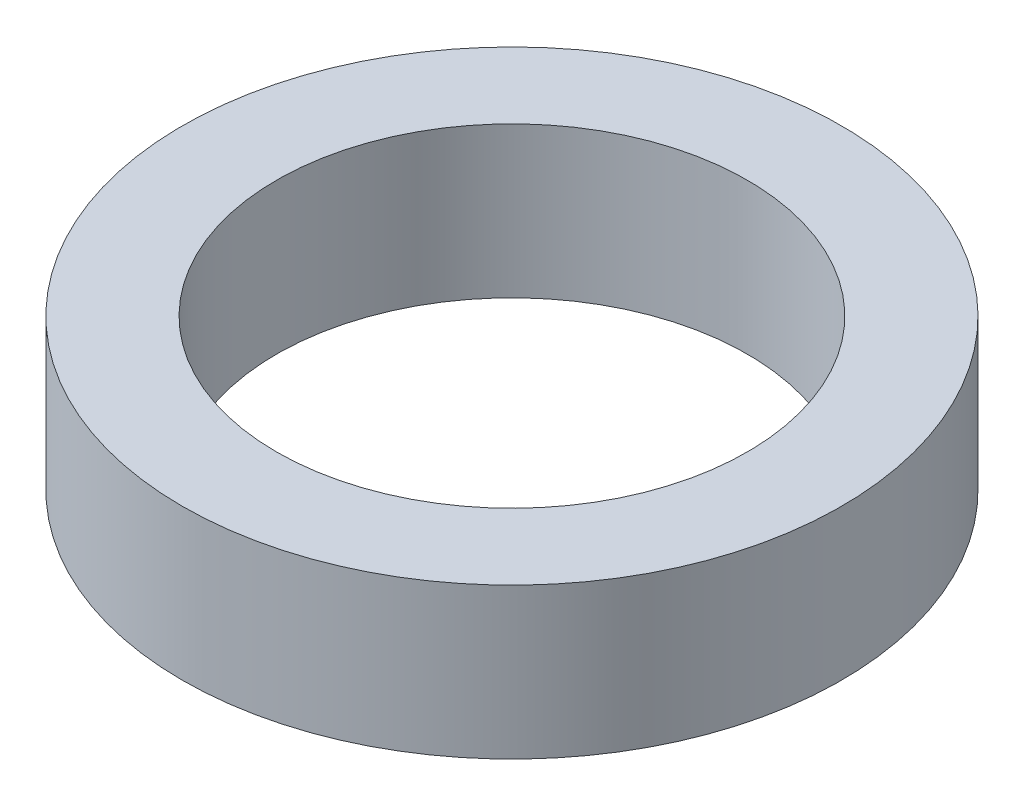
ISO-10303-21;
HEADER;
FILE_DESCRIPTION(('STEP AP214'),'2;1');
FILE_NAME('part.step','',(''),(''),'','','');
FILE_SCHEMA(('AUTOMOTIVE_DESIGN { 1 0 10303 214 1 1 1 1 }'));
ENDSEC;
DATA;
#1=APPLICATION_CONTEXT('core data for automotive mechanical design processes');
#2=APPLICATION_PROTOCOL_DEFINITION('international standard','automotive_design',2000,#1);
#3=PRODUCT_CONTEXT('',#1,'mechanical');
#4=PRODUCT('Part','Part','',(#3));
#5=PRODUCT_RELATED_PRODUCT_CATEGORY('part','',(#4));
#6=PRODUCT_DEFINITION_FORMATION('','',#4);
#7=PRODUCT_DEFINITION_CONTEXT('part definition',#1,'design');
#8=PRODUCT_DEFINITION('design','',#6,#7);
#9=PRODUCT_DEFINITION_SHAPE('','',#8);
#10=(LENGTH_UNIT() NAMED_UNIT(*) SI_UNIT(.MILLI.,.METRE.));
#11=(NAMED_UNIT(*) PLANE_ANGLE_UNIT() SI_UNIT($,.RADIAN.));
#12=(NAMED_UNIT(*) SI_UNIT($,.STERADIAN.) SOLID_ANGLE_UNIT());
#13=UNCERTAINTY_MEASURE_WITH_UNIT(LENGTH_MEASURE(1.E-05),#10,'distance_accuracy_value','');
#14=(GEOMETRIC_REPRESENTATION_CONTEXT(3) GLOBAL_UNCERTAINTY_ASSIGNED_CONTEXT((#13)) GLOBAL_UNIT_ASSIGNED_CONTEXT((#10,
#11,#12)) REPRESENTATION_CONTEXT('',''));
#15=CARTESIAN_POINT('',(0.,0.,0.));
#16=DIRECTION('',(0.,0.,1.));
#17=DIRECTION('',(1.,0.,0.));
#18=AXIS2_PLACEMENT_3D('',#15,#16,#17);
#19=CARTESIAN_POINT('',(0.,2.54,0.));
#20=DIRECTION('',(0.,-1.,0.));
#21=DIRECTION('',(0.,0.,-1.));
#22=AXIS2_PLACEMENT_3D('',#19,#20,#21);
#23=CYLINDRICAL_SURFACE('',#22,3.96875);
#24=CARTESIAN_POINT('',(0.,2.54,0.));
#25=DIRECTION('',(0.,1.,0.));
#26=DIRECTION('',(0.,0.,1.));
#27=AXIS2_PLACEMENT_3D('',#24,#25,#26);
#28=CIRCLE('',#27,3.96875);
#29=CARTESIAN_POINT('',(0.,2.54,3.96875));
#30=VERTEX_POINT('',#29);
#31=EDGE_CURVE('E63',#30,#30,#28,.T.);
#32=ORIENTED_EDGE('',*,*,#31,.T.);
#33=EDGE_LOOP('',(#32));
#34=FACE_BOUND('',#33,.T.);
#35=CARTESIAN_POINT('',(0.,0.,0.));
#36=DIRECTION('',(0.,1.,0.));
#37=DIRECTION('',(0.,0.,1.));
#38=AXIS2_PLACEMENT_3D('',#35,#36,#37);
#39=CIRCLE('',#38,3.96875);
#40=CARTESIAN_POINT('',(0.,0.,3.96875));
#41=VERTEX_POINT('',#40);
#42=EDGE_CURVE('E70',#41,#41,#39,.T.);
#43=ORIENTED_EDGE('',*,*,#42,.F.);
#44=EDGE_LOOP('',(#43));
#45=FACE_BOUND('',#44,.T.);
#46=ADVANCED_FACE('F55',(#34,#45),#23,.F.);
#47=CARTESIAN_POINT('',(0.,0.,0.));
#48=DIRECTION('',(0.,1.,0.));
#49=DIRECTION('',(0.,0.,1.));
#50=AXIS2_PLACEMENT_3D('',#47,#48,#49);
#51=PLANE('',#50);
#52=ORIENTED_EDGE('',*,*,#42,.T.);
#53=EDGE_LOOP('',(#52));
#54=FACE_BOUND('',#53,.T.);
#55=CARTESIAN_POINT('',(0.,0.,0.));
#56=DIRECTION('',(0.,1.,0.));
#57=DIRECTION('',(0.,0.,1.));
#58=AXIS2_PLACEMENT_3D('',#55,#56,#57);
#59=CIRCLE('',#58,5.55625);
#60=CARTESIAN_POINT('',(0.,0.,5.55625));
#61=VERTEX_POINT('',#60);
#62=EDGE_CURVE('E58',#61,#61,#59,.T.);
#63=ORIENTED_EDGE('',*,*,#62,.F.);
#64=EDGE_LOOP('',(#63));
#65=FACE_BOUND('',#64,.T.);
#66=ADVANCED_FACE('F81',(#54,#65),#51,.F.);
#67=CARTESIAN_POINT('',(0.,2.54,0.));
#68=DIRECTION('',(0.,-1.,0.));
#69=DIRECTION('',(0.,0.,-1.));
#70=AXIS2_PLACEMENT_3D('',#67,#68,#69);
#71=CYLINDRICAL_SURFACE('',#70,5.55625);
#72=CARTESIAN_POINT('',(0.,2.54,0.));
#73=DIRECTION('',(0.,1.,0.));
#74=DIRECTION('',(0.,0.,1.));
#75=AXIS2_PLACEMENT_3D('',#72,#73,#74);
#76=CIRCLE('',#75,5.55625);
#77=CARTESIAN_POINT('',(0.,2.54,5.55625));
#78=VERTEX_POINT('',#77);
#79=EDGE_CURVE('E11',#78,#78,#76,.T.);
#80=ORIENTED_EDGE('',*,*,#79,.F.);
#81=EDGE_LOOP('',(#80));
#82=FACE_BOUND('',#81,.T.);
#83=ORIENTED_EDGE('',*,*,#62,.T.);
#84=EDGE_LOOP('',(#83));
#85=FACE_BOUND('',#84,.T.);
#86=ADVANCED_FACE('F79',(#82,#85),#71,.T.);
#87=CARTESIAN_POINT('',(0.,2.54,0.));
#88=DIRECTION('',(0.,1.,0.));
#89=DIRECTION('',(0.,0.,1.));
#90=AXIS2_PLACEMENT_3D('',#87,#88,#89);
#91=PLANE('',#90);
#92=ORIENTED_EDGE('',*,*,#31,.F.);
#93=EDGE_LOOP('',(#92));
#94=FACE_BOUND('',#93,.T.);
#95=ORIENTED_EDGE('',*,*,#79,.T.);
#96=EDGE_LOOP('',(#95));
#97=FACE_BOUND('',#96,.T.);
#98=ADVANCED_FACE('F88',(#94,#97),#91,.T.);
#99=CLOSED_SHELL('',(#46,#66,#86,#98));
#100=MANIFOLD_SOLID_BREP('B2',#99);
#101=ADVANCED_BREP_SHAPE_REPRESENTATION('',(#18,#100),#14);
#102=SHAPE_DEFINITION_REPRESENTATION(#9,#101);
ENDSEC;
END-ISO-10303-21;
